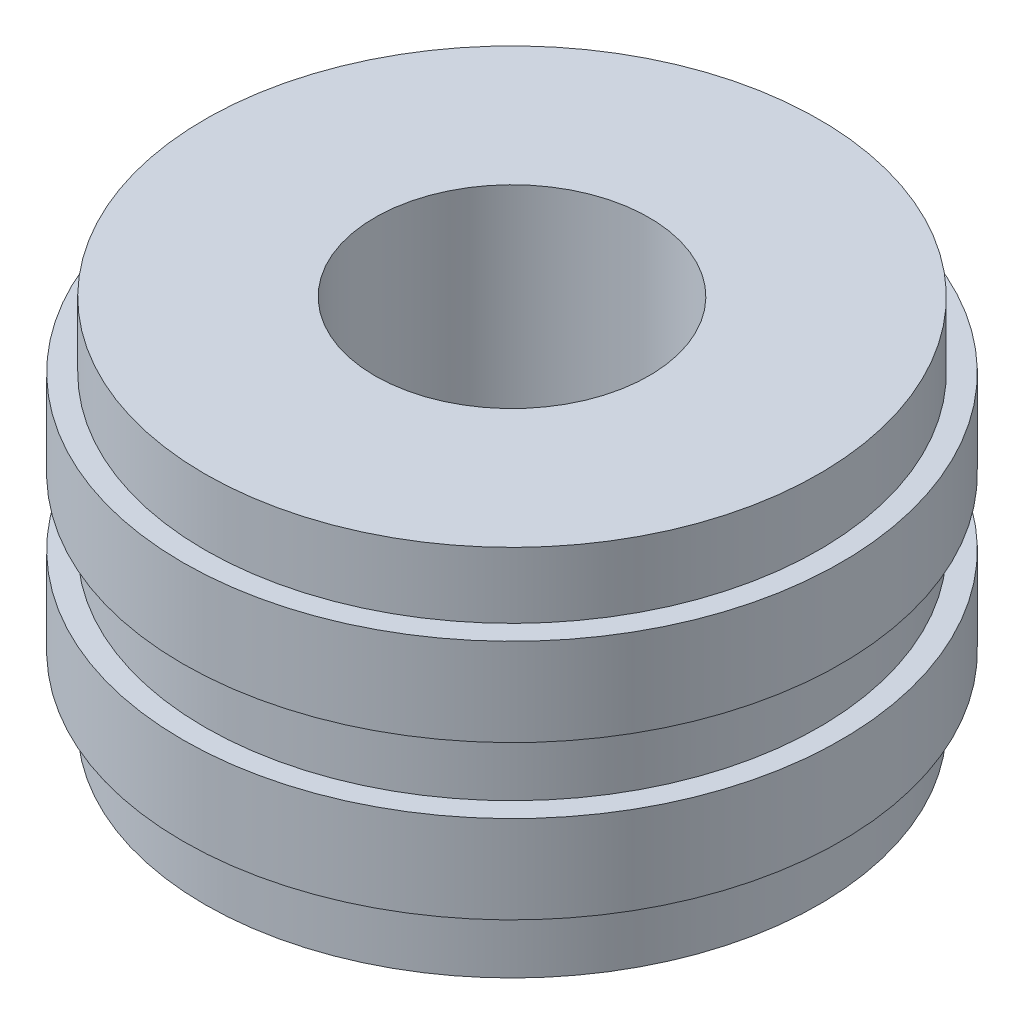
ISO-10303-21;
HEADER;
FILE_DESCRIPTION(('STEP AP214'),'2;1');
FILE_NAME('part.step','',(''),(''),'','','');
FILE_SCHEMA(('AUTOMOTIVE_DESIGN { 1 0 10303 214 1 1 1 1 }'));
ENDSEC;
DATA;
#1=APPLICATION_CONTEXT('core data for automotive mechanical design processes');
#2=APPLICATION_PROTOCOL_DEFINITION('international standard','automotive_design',2000,#1);
#3=PRODUCT_CONTEXT('',#1,'mechanical');
#4=PRODUCT('Part','Part','',(#3));
#5=PRODUCT_RELATED_PRODUCT_CATEGORY('part','',(#4));
#6=PRODUCT_DEFINITION_FORMATION('','',#4);
#7=PRODUCT_DEFINITION_CONTEXT('part definition',#1,'design');
#8=PRODUCT_DEFINITION('design','',#6,#7);
#9=PRODUCT_DEFINITION_SHAPE('','',#8);
#10=(LENGTH_UNIT() NAMED_UNIT(*) SI_UNIT(.MILLI.,.METRE.));
#11=(NAMED_UNIT(*) PLANE_ANGLE_UNIT() SI_UNIT($,.RADIAN.));
#12=(NAMED_UNIT(*) SI_UNIT($,.STERADIAN.) SOLID_ANGLE_UNIT());
#13=UNCERTAINTY_MEASURE_WITH_UNIT(LENGTH_MEASURE(1.E-05),#10,'distance_accuracy_value','');
#14=(GEOMETRIC_REPRESENTATION_CONTEXT(3) GLOBAL_UNCERTAINTY_ASSIGNED_CONTEXT((#13)) GLOBAL_UNIT_ASSIGNED_CONTEXT((#10,
#11,#12)) REPRESENTATION_CONTEXT('',''));
#15=CARTESIAN_POINT('',(0.,0.,0.));
#16=DIRECTION('',(0.,0.,1.));
#17=DIRECTION('',(1.,0.,0.));
#18=AXIS2_PLACEMENT_3D('',#15,#16,#17);
#19=CARTESIAN_POINT('',(0.,0.,0.));
#20=DIRECTION('',(0.,1.,0.));
#21=DIRECTION('',(0.,0.,1.));
#22=AXIS2_PLACEMENT_3D('',#19,#20,#21);
#23=PLANE('',#22);
#24=CARTESIAN_POINT('',(0.,0.,0.));
#25=DIRECTION('',(0.,1.,0.));
#26=DIRECTION('',(0.,0.,1.));
#27=AXIS2_PLACEMENT_3D('',#24,#25,#26);
#28=CIRCLE('',#27,12.5);
#29=CARTESIAN_POINT('',(0.,0.,12.5));
#30=VERTEX_POINT('',#29);
#31=EDGE_CURVE('E40',#30,#30,#28,.T.);
#32=ORIENTED_EDGE('',*,*,#31,.T.);
#33=EDGE_LOOP('',(#32));
#34=FACE_BOUND('',#33,.T.);
#35=CARTESIAN_POINT('',(0.,0.,0.));
#36=DIRECTION('',(0.,1.,0.));
#37=DIRECTION('',(0.,0.,1.));
#38=AXIS2_PLACEMENT_3D('',#35,#36,#37);
#39=CIRCLE('',#38,28.);
#40=CARTESIAN_POINT('',(0.,0.,28.));
#41=VERTEX_POINT('',#40);
#42=EDGE_CURVE('E62',#41,#41,#39,.T.);
#43=ORIENTED_EDGE('',*,*,#42,.F.);
#44=EDGE_LOOP('',(#43));
#45=FACE_BOUND('',#44,.T.);
#46=ADVANCED_FACE('F36',(#34,#45),#23,.F.);
#47=CARTESIAN_POINT('',(0.,34.,0.));
#48=DIRECTION('',(0.,1.,0.));
#49=DIRECTION('',(0.,0.,1.));
#50=AXIS2_PLACEMENT_3D('',#47,#48,#49);
#51=PLANE('',#50);
#52=CARTESIAN_POINT('',(0.,34.,0.));
#53=DIRECTION('',(0.,1.,0.));
#54=DIRECTION('',(0.,0.,1.));
#55=AXIS2_PLACEMENT_3D('',#52,#53,#54);
#56=CIRCLE('',#55,12.5);
#57=CARTESIAN_POINT('',(0.,34.,12.5));
#58=VERTEX_POINT('',#57);
#59=EDGE_CURVE('E10',#58,#58,#56,.T.);
#60=ORIENTED_EDGE('',*,*,#59,.F.);
#61=EDGE_LOOP('',(#60));
#62=FACE_BOUND('',#61,.T.);
#63=CARTESIAN_POINT('',(0.,34.,0.));
#64=DIRECTION('',(0.,1.,0.));
#65=DIRECTION('',(0.,0.,1.));
#66=AXIS2_PLACEMENT_3D('',#63,#64,#65);
#67=CIRCLE('',#66,28.);
#68=CARTESIAN_POINT('',(0.,34.,28.));
#69=VERTEX_POINT('',#68);
#70=EDGE_CURVE('E52',#69,#69,#67,.T.);
#71=ORIENTED_EDGE('',*,*,#70,.T.);
#72=EDGE_LOOP('',(#71));
#73=FACE_BOUND('',#72,.T.);
#74=ADVANCED_FACE('F101',(#62,#73),#51,.T.);
#75=CARTESIAN_POINT('',(0.,34.,0.));
#76=DIRECTION('',(0.,-1.,0.));
#77=DIRECTION('',(0.,0.,-1.));
#78=AXIS2_PLACEMENT_3D('',#75,#76,#77);
#79=CYLINDRICAL_SURFACE('',#78,30.);
#80=CARTESIAN_POINT('',(0.,20.,0.));
#81=DIRECTION('',(0.,1.,0.));
#82=DIRECTION('',(0.,0.,1.));
#83=AXIS2_PLACEMENT_3D('',#80,#81,#82);
#84=CIRCLE('',#83,30.);
#85=CARTESIAN_POINT('',(0.,20.,30.));
#86=VERTEX_POINT('',#85);
#87=EDGE_CURVE('E68',#86,#86,#84,.T.);
#88=ORIENTED_EDGE('',*,*,#87,.T.);
#89=EDGE_LOOP('',(#88));
#90=FACE_BOUND('',#89,.T.);
#91=CARTESIAN_POINT('',(0.,28.,0.));
#92=DIRECTION('',(0.,1.,0.));
#93=DIRECTION('',(0.,0.,1.));
#94=AXIS2_PLACEMENT_3D('',#91,#92,#93);
#95=CIRCLE('',#94,30.);
#96=CARTESIAN_POINT('',(0.,28.,30.));
#97=VERTEX_POINT('',#96);
#98=EDGE_CURVE('E47',#97,#97,#95,.T.);
#99=ORIENTED_EDGE('',*,*,#98,.F.);
#100=EDGE_LOOP('',(#99));
#101=FACE_BOUND('',#100,.T.);
#102=ADVANCED_FACE('F38',(#90,#101),#79,.T.);
#103=CARTESIAN_POINT('',(0.,34.,0.));
#104=DIRECTION('',(0.,-1.,0.));
#105=DIRECTION('',(0.,0.,-1.));
#106=AXIS2_PLACEMENT_3D('',#103,#104,#105);
#107=CYLINDRICAL_SURFACE('',#106,12.5);
#108=ORIENTED_EDGE('',*,*,#59,.T.);
#109=EDGE_LOOP('',(#108));
#110=FACE_BOUND('',#109,.T.);
#111=ORIENTED_EDGE('',*,*,#31,.F.);
#112=EDGE_LOOP('',(#111));
#113=FACE_BOUND('',#112,.T.);
#114=ADVANCED_FACE('F100',(#110,#113),#107,.F.);
#115=CARTESIAN_POINT('',(0.,28.,0.));
#116=DIRECTION('',(0.,1.,0.));
#117=DIRECTION('',(0.,0.,1.));
#118=AXIS2_PLACEMENT_3D('',#115,#116,#117);
#119=PLANE('',#118);
#120=CARTESIAN_POINT('',(0.,28.,0.));
#121=DIRECTION('',(0.,1.,0.));
#122=DIRECTION('',(0.,0.,1.));
#123=AXIS2_PLACEMENT_3D('',#120,#121,#122);
#124=CIRCLE('',#123,28.);
#125=CARTESIAN_POINT('',(0.,28.,28.));
#126=VERTEX_POINT('',#125);
#127=EDGE_CURVE('E51',#126,#126,#124,.T.);
#128=ORIENTED_EDGE('',*,*,#127,.F.);
#129=EDGE_LOOP('',(#128));
#130=FACE_BOUND('',#129,.T.);
#131=ORIENTED_EDGE('',*,*,#98,.T.);
#132=EDGE_LOOP('',(#131));
#133=FACE_BOUND('',#132,.T.);
#134=ADVANCED_FACE('F114',(#130,#133),#119,.T.);
#135=CARTESIAN_POINT('',(0.,28.,0.));
#136=DIRECTION('',(0.,1.,0.));
#137=DIRECTION('',(0.,0.,1.));
#138=AXIS2_PLACEMENT_3D('',#135,#136,#137);
#139=CYLINDRICAL_SURFACE('',#138,28.);
#140=ORIENTED_EDGE('',*,*,#127,.T.);
#141=EDGE_LOOP('',(#140));
#142=FACE_BOUND('',#141,.T.);
#143=ORIENTED_EDGE('',*,*,#70,.F.);
#144=EDGE_LOOP('',(#143));
#145=FACE_BOUND('',#144,.T.);
#146=ADVANCED_FACE('F117',(#142,#145),#139,.T.);
#147=CARTESIAN_POINT('',(0.,6.,0.));
#148=DIRECTION('',(0.,1.,0.));
#149=DIRECTION('',(0.,0.,1.));
#150=AXIS2_PLACEMENT_3D('',#147,#148,#149);
#151=PLANE('',#150);
#152=CARTESIAN_POINT('',(0.,6.,0.));
#153=DIRECTION('',(0.,1.,0.));
#154=DIRECTION('',(0.,0.,1.));
#155=AXIS2_PLACEMENT_3D('',#152,#153,#154);
#156=CIRCLE('',#155,28.);
#157=CARTESIAN_POINT('',(0.,6.,28.));
#158=VERTEX_POINT('',#157);
#159=EDGE_CURVE('E63',#158,#158,#156,.T.);
#160=ORIENTED_EDGE('',*,*,#159,.T.);
#161=EDGE_LOOP('',(#160));
#162=FACE_BOUND('',#161,.T.);
#163=CARTESIAN_POINT('',(0.,6.,0.));
#164=DIRECTION('',(0.,1.,0.));
#165=DIRECTION('',(0.,0.,1.));
#166=AXIS2_PLACEMENT_3D('',#163,#164,#165);
#167=CIRCLE('',#166,30.);
#168=CARTESIAN_POINT('',(0.,6.,30.));
#169=VERTEX_POINT('',#168);
#170=EDGE_CURVE('E58',#169,#169,#167,.T.);
#171=ORIENTED_EDGE('',*,*,#170,.F.);
#172=EDGE_LOOP('',(#171));
#173=FACE_BOUND('',#172,.T.);
#174=ADVANCED_FACE('F96',(#162,#173),#151,.F.);
#175=CARTESIAN_POINT('',(0.,0.,0.));
#176=DIRECTION('',(0.,1.,0.));
#177=DIRECTION('',(0.,0.,1.));
#178=AXIS2_PLACEMENT_3D('',#175,#176,#177);
#179=CYLINDRICAL_SURFACE('',#178,28.);
#180=ORIENTED_EDGE('',*,*,#42,.T.);
#181=EDGE_LOOP('',(#180));
#182=FACE_BOUND('',#181,.T.);
#183=ORIENTED_EDGE('',*,*,#159,.F.);
#184=EDGE_LOOP('',(#183));
#185=FACE_BOUND('',#184,.T.);
#186=ADVANCED_FACE('F91',(#182,#185),#179,.T.);
#187=ORIENTED_EDGE('',*,*,#170,.T.);
#188=EDGE_LOOP('',(#187));
#189=FACE_BOUND('',#188,.T.);
#190=CARTESIAN_POINT('',(0.,14.,0.));
#191=DIRECTION('',(0.,1.,0.));
#192=DIRECTION('',(0.,0.,1.));
#193=AXIS2_PLACEMENT_3D('',#190,#191,#192);
#194=CIRCLE('',#193,30.);
#195=CARTESIAN_POINT('',(0.,14.,30.));
#196=VERTEX_POINT('',#195);
#197=EDGE_CURVE('E55',#196,#196,#194,.T.);
#198=ORIENTED_EDGE('',*,*,#197,.F.);
#199=EDGE_LOOP('',(#198));
#200=FACE_BOUND('',#199,.T.);
#201=ADVANCED_FACE('F86',(#189,#200),#79,.T.);
#202=CARTESIAN_POINT('',(0.,14.,0.));
#203=DIRECTION('',(0.,1.,0.));
#204=DIRECTION('',(0.,0.,1.));
#205=AXIS2_PLACEMENT_3D('',#202,#203,#204);
#206=PLANE('',#205);
#207=CARTESIAN_POINT('',(0.,14.,0.));
#208=DIRECTION('',(0.,1.,0.));
#209=DIRECTION('',(0.,0.,1.));
#210=AXIS2_PLACEMENT_3D('',#207,#208,#209);
#211=CIRCLE('',#210,28.);
#212=CARTESIAN_POINT('',(0.,14.,28.));
#213=VERTEX_POINT('',#212);
#214=EDGE_CURVE('E71',#213,#213,#211,.T.);
#215=ORIENTED_EDGE('',*,*,#214,.F.);
#216=EDGE_LOOP('',(#215));
#217=FACE_BOUND('',#216,.T.);
#218=ORIENTED_EDGE('',*,*,#197,.T.);
#219=EDGE_LOOP('',(#218));
#220=FACE_BOUND('',#219,.T.);
#221=ADVANCED_FACE('F82',(#217,#220),#206,.T.);
#222=CARTESIAN_POINT('',(0.,20.,0.));
#223=DIRECTION('',(0.,1.,0.));
#224=DIRECTION('',(0.,0.,1.));
#225=AXIS2_PLACEMENT_3D('',#222,#223,#224);
#226=PLANE('',#225);
#227=CARTESIAN_POINT('',(0.,20.,0.));
#228=DIRECTION('',(0.,1.,0.));
#229=DIRECTION('',(0.,0.,1.));
#230=AXIS2_PLACEMENT_3D('',#227,#228,#229);
#231=CIRCLE('',#230,28.);
#232=CARTESIAN_POINT('',(0.,20.,28.));
#233=VERTEX_POINT('',#232);
#234=EDGE_CURVE('E61',#233,#233,#231,.T.);
#235=ORIENTED_EDGE('',*,*,#234,.T.);
#236=EDGE_LOOP('',(#235));
#237=FACE_BOUND('',#236,.T.);
#238=ORIENTED_EDGE('',*,*,#87,.F.);
#239=EDGE_LOOP('',(#238));
#240=FACE_BOUND('',#239,.T.);
#241=ADVANCED_FACE('F85',(#237,#240),#226,.F.);
#242=CARTESIAN_POINT('',(0.,14.,0.));
#243=DIRECTION('',(0.,1.,0.));
#244=DIRECTION('',(0.,0.,1.));
#245=AXIS2_PLACEMENT_3D('',#242,#243,#244);
#246=CYLINDRICAL_SURFACE('',#245,28.);
#247=ORIENTED_EDGE('',*,*,#214,.T.);
#248=EDGE_LOOP('',(#247));
#249=FACE_BOUND('',#248,.T.);
#250=ORIENTED_EDGE('',*,*,#234,.F.);
#251=EDGE_LOOP('',(#250));
#252=FACE_BOUND('',#251,.T.);
#253=ADVANCED_FACE('F79',(#249,#252),#246,.T.);
#254=CLOSED_SHELL('',(#46,#74,#102,#114,#134,#146,#174,#186,#201,#221,#241,#253));
#255=MANIFOLD_SOLID_BREP('B2',#254);
#256=ADVANCED_BREP_SHAPE_REPRESENTATION('',(#18,#255),#14);
#257=SHAPE_DEFINITION_REPRESENTATION(#9,#256);
ENDSEC;
END-ISO-10303-21;
